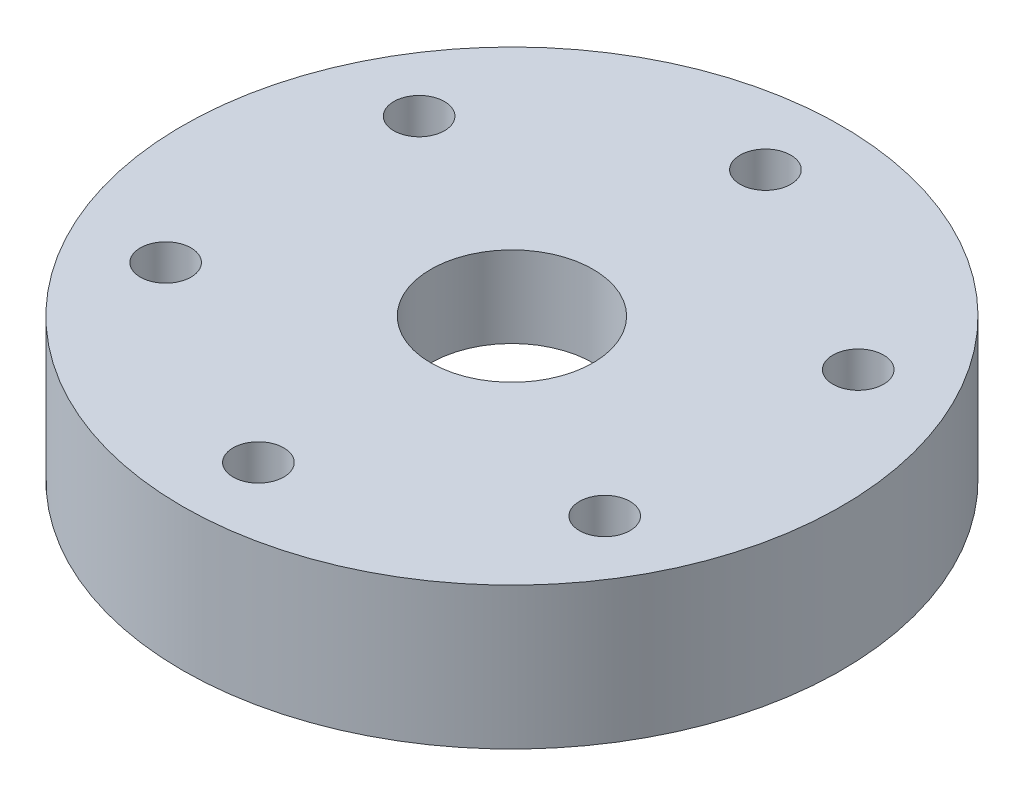
ISO-10303-21;
HEADER;
FILE_DESCRIPTION(('STEP AP214'),'2;1');
FILE_NAME('part.step','',(''),(''),'','','');
FILE_SCHEMA(('AUTOMOTIVE_DESIGN { 1 0 10303 214 1 1 1 1 }'));
ENDSEC;
DATA;
#1=APPLICATION_CONTEXT('core data for automotive mechanical design processes');
#2=APPLICATION_PROTOCOL_DEFINITION('international standard','automotive_design',2000,#1);
#3=PRODUCT_CONTEXT('',#1,'mechanical');
#4=PRODUCT('Part','Part','',(#3));
#5=PRODUCT_RELATED_PRODUCT_CATEGORY('part','',(#4));
#6=PRODUCT_DEFINITION_FORMATION('','',#4);
#7=PRODUCT_DEFINITION_CONTEXT('part definition',#1,'design');
#8=PRODUCT_DEFINITION('design','',#6,#7);
#9=PRODUCT_DEFINITION_SHAPE('','',#8);
#10=(LENGTH_UNIT() NAMED_UNIT(*) SI_UNIT(.MILLI.,.METRE.));
#11=(NAMED_UNIT(*) PLANE_ANGLE_UNIT() SI_UNIT($,.RADIAN.));
#12=(NAMED_UNIT(*) SI_UNIT($,.STERADIAN.) SOLID_ANGLE_UNIT());
#13=UNCERTAINTY_MEASURE_WITH_UNIT(LENGTH_MEASURE(1.E-05),#10,'distance_accuracy_value','');
#14=(GEOMETRIC_REPRESENTATION_CONTEXT(3) GLOBAL_UNCERTAINTY_ASSIGNED_CONTEXT((#13)) GLOBAL_UNIT_ASSIGNED_CONTEXT((#10,
#11,#12)) REPRESENTATION_CONTEXT('',''));
#15=CARTESIAN_POINT('',(0.,0.,0.));
#16=DIRECTION('',(0.,0.,1.));
#17=DIRECTION('',(1.,0.,0.));
#18=AXIS2_PLACEMENT_3D('',#15,#16,#17);
#19=CARTESIAN_POINT('',(0.,16.7085798816568,0.));
#20=DIRECTION('',(0.,1.,0.));
#21=DIRECTION('',(0.,0.,1.));
#22=AXIS2_PLACEMENT_3D('',#19,#20,#21);
#23=CYLINDRICAL_SURFACE('',#22,32.5);
#24=CARTESIAN_POINT('',(0.,-9.78550295857989,0.));
#25=DIRECTION('',(0.,1.,0.));
#26=DIRECTION('',(0.,0.,1.));
#27=AXIS2_PLACEMENT_3D('',#24,#25,#26);
#28=CIRCLE('',#27,32.5);
#29=CARTESIAN_POINT('',(0.,-9.78550295857989,32.5));
#30=VERTEX_POINT('',#29);
#31=EDGE_CURVE('E10',#30,#30,#28,.T.);
#32=ORIENTED_EDGE('',*,*,#31,.T.);
#33=EDGE_LOOP('',(#32));
#34=FACE_BOUND('',#33,.T.);
#35=CARTESIAN_POINT('',(0.,4.21449704142011,0.));
#36=DIRECTION('',(0.,1.,0.));
#37=DIRECTION('',(0.,0.,1.));
#38=AXIS2_PLACEMENT_3D('',#35,#36,#37);
#39=CIRCLE('',#38,32.5);
#40=CARTESIAN_POINT('',(0.,4.21449704142011,32.5));
#41=VERTEX_POINT('',#40);
#42=EDGE_CURVE('E64',#41,#41,#39,.T.);
#43=ORIENTED_EDGE('',*,*,#42,.F.);
#44=EDGE_LOOP('',(#43));
#45=FACE_BOUND('',#44,.T.);
#46=ADVANCED_FACE('F31',(#34,#45),#23,.T.);
#47=CARTESIAN_POINT('',(-32.5,-9.78550295857989,0.));
#48=DIRECTION('',(0.,-1.,0.));
#49=DIRECTION('',(0.,0.,-1.));
#50=AXIS2_PLACEMENT_3D('',#47,#48,#49);
#51=PLANE('',#50);
#52=CARTESIAN_POINT('',(0.,-9.78550295857989,25.));
#53=DIRECTION('',(0.,-1.,0.));
#54=DIRECTION('',(0.,0.,-1.));
#55=AXIS2_PLACEMENT_3D('',#52,#53,#54);
#56=CIRCLE('',#55,2.5);
#57=CARTESIAN_POINT('',(0.,-9.78550295857989,22.5));
#58=VERTEX_POINT('',#57);
#59=EDGE_CURVE('E51',#58,#58,#56,.T.);
#60=ORIENTED_EDGE('',*,*,#59,.F.);
#61=EDGE_LOOP('',(#60));
#62=FACE_BOUND('',#61,.T.);
#63=CARTESIAN_POINT('',(-21.6506350946104,-9.78550295857989,12.4999999999991));
#64=DIRECTION('',(0.,-1.,0.));
#65=DIRECTION('',(0.,0.,-1.));
#66=AXIS2_PLACEMENT_3D('',#63,#64,#65);
#67=CIRCLE('',#66,2.50000000000107);
#68=CARTESIAN_POINT('',(-21.6506350946104,-9.78550295857989,9.99999999999799));
#69=VERTEX_POINT('',#68);
#70=EDGE_CURVE('E114',#69,#69,#67,.T.);
#71=ORIENTED_EDGE('',*,*,#70,.F.);
#72=EDGE_LOOP('',(#71));
#73=FACE_BOUND('',#72,.T.);
#74=CARTESIAN_POINT('',(-21.6506350946094,-9.78550295857989,-12.5000000000009));
#75=DIRECTION('',(0.,-1.,0.));
#76=DIRECTION('',(0.,0.,-1.));
#77=AXIS2_PLACEMENT_3D('',#74,#75,#76);
#78=CIRCLE('',#77,2.50000000000202);
#79=CARTESIAN_POINT('',(-21.6506350946094,-9.78550295857989,-15.000000000003));
#80=VERTEX_POINT('',#79);
#81=EDGE_CURVE('E76',#80,#80,#78,.T.);
#82=ORIENTED_EDGE('',*,*,#81,.F.);
#83=EDGE_LOOP('',(#82));
#84=FACE_BOUND('',#83,.T.);
#85=CARTESIAN_POINT('',(2.1224433562867E-12,-9.78550295857989,-25.));
#86=DIRECTION('',(0.,-1.,0.));
#87=DIRECTION('',(0.,0.,-1.));
#88=AXIS2_PLACEMENT_3D('',#85,#86,#87);
#89=CIRCLE('',#88,2.5000000000022);
#90=CARTESIAN_POINT('',(2.1224433562867E-12,-9.78550295857989,-27.5000000000022));
#91=VERTEX_POINT('',#90);
#92=EDGE_CURVE('E121',#91,#91,#89,.T.);
#93=ORIENTED_EDGE('',*,*,#92,.F.);
#94=EDGE_LOOP('',(#93));
#95=FACE_BOUND('',#94,.T.);
#96=CARTESIAN_POINT('',(21.6506350946126,-9.78550295857989,-12.4999999999991));
#97=DIRECTION('',(0.,-1.,0.));
#98=DIRECTION('',(0.,0.,-1.));
#99=AXIS2_PLACEMENT_3D('',#96,#97,#98);
#100=CIRCLE('',#99,2.50000000000137);
#101=CARTESIAN_POINT('',(21.6506350946126,-9.78550295857989,-15.0000000000004));
#102=VERTEX_POINT('',#101);
#103=EDGE_CURVE('E125',#102,#102,#100,.T.);
#104=ORIENTED_EDGE('',*,*,#103,.F.);
#105=EDGE_LOOP('',(#104));
#106=FACE_BOUND('',#105,.T.);
#107=CARTESIAN_POINT('',(21.6506350946115,-9.78550295857989,12.5000000000009));
#108=DIRECTION('',(0.,-1.,0.));
#109=DIRECTION('',(0.,0.,-1.));
#110=AXIS2_PLACEMENT_3D('',#107,#108,#109);
#111=CIRCLE('',#110,2.5000000000003);
#112=CARTESIAN_POINT('',(21.6506350946115,-9.78550295857989,10.0000000000006));
#113=VERTEX_POINT('',#112);
#114=EDGE_CURVE('E129',#113,#113,#111,.T.);
#115=ORIENTED_EDGE('',*,*,#114,.F.);
#116=EDGE_LOOP('',(#115));
#117=FACE_BOUND('',#116,.T.);
#118=CARTESIAN_POINT('',(0.,-9.78550295857989,0.));
#119=DIRECTION('',(0.,1.,0.));
#120=DIRECTION('',(0.,0.,1.));
#121=AXIS2_PLACEMENT_3D('',#118,#119,#120);
#122=CIRCLE('',#121,17.5);
#123=CARTESIAN_POINT('',(0.,-9.78550295857989,17.5));
#124=VERTEX_POINT('',#123);
#125=EDGE_CURVE('E38',#124,#124,#122,.T.);
#126=ORIENTED_EDGE('',*,*,#125,.T.);
#127=EDGE_LOOP('',(#126));
#128=FACE_BOUND('',#127,.T.);
#129=ORIENTED_EDGE('',*,*,#31,.F.);
#130=EDGE_LOOP('',(#129));
#131=FACE_BOUND('',#130,.T.);
#132=ADVANCED_FACE('F98',(#62,#73,#84,#95,#106,#117,#128,#131),#51,.T.);
#133=CARTESIAN_POINT('',(0.,16.7085798816568,0.));
#134=DIRECTION('',(0.,1.,0.));
#135=DIRECTION('',(0.,0.,1.));
#136=AXIS2_PLACEMENT_3D('',#133,#134,#135);
#137=CYLINDRICAL_SURFACE('',#136,17.5);
#138=CARTESIAN_POINT('',(0.,-3.78550295857989,0.));
#139=DIRECTION('',(0.,1.,0.));
#140=DIRECTION('',(0.,0.,1.));
#141=AXIS2_PLACEMENT_3D('',#138,#139,#140);
#142=CIRCLE('',#141,17.5);
#143=CARTESIAN_POINT('',(0.,-3.78550295857989,17.5));
#144=VERTEX_POINT('',#143);
#145=EDGE_CURVE('E43',#144,#144,#142,.T.);
#146=ORIENTED_EDGE('',*,*,#145,.T.);
#147=EDGE_LOOP('',(#146));
#148=FACE_BOUND('',#147,.T.);
#149=ORIENTED_EDGE('',*,*,#125,.F.);
#150=EDGE_LOOP('',(#149));
#151=FACE_BOUND('',#150,.T.);
#152=ADVANCED_FACE('F83',(#148,#151),#137,.F.);
#153=CARTESIAN_POINT('',(-17.5,-3.78550295857989,0.));
#154=DIRECTION('',(0.,-1.,0.));
#155=DIRECTION('',(0.,0.,-1.));
#156=AXIS2_PLACEMENT_3D('',#153,#154,#155);
#157=PLANE('',#156);
#158=CARTESIAN_POINT('',(0.,-3.78550295857989,0.));
#159=DIRECTION('',(0.,1.,0.));
#160=DIRECTION('',(0.,0.,1.));
#161=AXIS2_PLACEMENT_3D('',#158,#159,#160);
#162=CIRCLE('',#161,8.);
#163=CARTESIAN_POINT('',(0.,-3.78550295857989,8.));
#164=VERTEX_POINT('',#163);
#165=EDGE_CURVE('E73',#164,#164,#162,.T.);
#166=ORIENTED_EDGE('',*,*,#165,.T.);
#167=EDGE_LOOP('',(#166));
#168=FACE_BOUND('',#167,.T.);
#169=ORIENTED_EDGE('',*,*,#145,.F.);
#170=EDGE_LOOP('',(#169));
#171=FACE_BOUND('',#170,.T.);
#172=ADVANCED_FACE('F86',(#168,#171),#157,.T.);
#173=CARTESIAN_POINT('',(0.,16.7085798816568,0.));
#174=DIRECTION('',(0.,1.,0.));
#175=DIRECTION('',(0.,0.,1.));
#176=AXIS2_PLACEMENT_3D('',#173,#174,#175);
#177=CYLINDRICAL_SURFACE('',#176,8.);
#178=CARTESIAN_POINT('',(0.,4.21449704142012,0.));
#179=DIRECTION('',(0.,1.,0.));
#180=DIRECTION('',(0.,0.,1.));
#181=AXIS2_PLACEMENT_3D('',#178,#179,#180);
#182=CIRCLE('',#181,8.);
#183=CARTESIAN_POINT('',(0.,4.21449704142012,8.));
#184=VERTEX_POINT('',#183);
#185=EDGE_CURVE('E68',#184,#184,#182,.T.);
#186=ORIENTED_EDGE('',*,*,#185,.T.);
#187=EDGE_LOOP('',(#186));
#188=FACE_BOUND('',#187,.T.);
#189=ORIENTED_EDGE('',*,*,#165,.F.);
#190=EDGE_LOOP('',(#189));
#191=FACE_BOUND('',#190,.T.);
#192=ADVANCED_FACE('F88',(#188,#191),#177,.F.);
#193=CARTESIAN_POINT('',(-8.,4.21449704142011,0.));
#194=DIRECTION('',(0.,1.,0.));
#195=DIRECTION('',(0.,0.,1.));
#196=AXIS2_PLACEMENT_3D('',#193,#194,#195);
#197=PLANE('',#196);
#198=CARTESIAN_POINT('',(0.,4.21449704142011,25.));
#199=DIRECTION('',(0.,1.,0.));
#200=DIRECTION('',(0.,0.,1.));
#201=AXIS2_PLACEMENT_3D('',#198,#199,#200);
#202=CIRCLE('',#201,2.5);
#203=CARTESIAN_POINT('',(0.,4.21449704142011,27.5));
#204=VERTEX_POINT('',#203);
#205=EDGE_CURVE('E34',#204,#204,#202,.T.);
#206=ORIENTED_EDGE('',*,*,#205,.F.);
#207=EDGE_LOOP('',(#206));
#208=FACE_BOUND('',#207,.T.);
#209=CARTESIAN_POINT('',(-21.6506350946104,4.21449704142011,12.4999999999991));
#210=DIRECTION('',(0.,1.,0.));
#211=DIRECTION('',(0.,0.,1.));
#212=AXIS2_PLACEMENT_3D('',#209,#210,#211);
#213=CIRCLE('',#212,2.50000000000107);
#214=CARTESIAN_POINT('',(-21.6506350946104,4.21449704142011,15.0000000000001));
#215=VERTEX_POINT('',#214);
#216=EDGE_CURVE('E59',#215,#215,#213,.T.);
#217=ORIENTED_EDGE('',*,*,#216,.F.);
#218=EDGE_LOOP('',(#217));
#219=FACE_BOUND('',#218,.T.);
#220=CARTESIAN_POINT('',(-21.6506350946094,4.21449704142011,-12.5000000000009));
#221=DIRECTION('',(0.,1.,0.));
#222=DIRECTION('',(0.,0.,1.));
#223=AXIS2_PLACEMENT_3D('',#220,#221,#222);
#224=CIRCLE('',#223,2.50000000000202);
#225=CARTESIAN_POINT('',(-21.6506350946094,4.21449704142011,-9.9999999999989));
#226=VERTEX_POINT('',#225);
#227=EDGE_CURVE('E57',#226,#226,#224,.T.);
#228=ORIENTED_EDGE('',*,*,#227,.F.);
#229=EDGE_LOOP('',(#228));
#230=FACE_BOUND('',#229,.T.);
#231=CARTESIAN_POINT('',(2.1224433562867E-12,4.21449704142011,-25.));
#232=DIRECTION('',(0.,1.,0.));
#233=DIRECTION('',(0.,0.,1.));
#234=AXIS2_PLACEMENT_3D('',#231,#232,#233);
#235=CIRCLE('',#234,2.5000000000022);
#236=CARTESIAN_POINT('',(2.1224433562867E-12,4.21449704142011,-22.4999999999978));
#237=VERTEX_POINT('',#236);
#238=EDGE_CURVE('E54',#237,#237,#235,.T.);
#239=ORIENTED_EDGE('',*,*,#238,.F.);
#240=EDGE_LOOP('',(#239));
#241=FACE_BOUND('',#240,.T.);
#242=CARTESIAN_POINT('',(21.6506350946126,4.21449704142011,-12.4999999999991));
#243=DIRECTION('',(0.,1.,0.));
#244=DIRECTION('',(0.,0.,1.));
#245=AXIS2_PLACEMENT_3D('',#242,#243,#244);
#246=CIRCLE('',#245,2.50000000000137);
#247=CARTESIAN_POINT('',(21.6506350946126,4.21449704142011,-9.99999999999771));
#248=VERTEX_POINT('',#247);
#249=EDGE_CURVE('E50',#248,#248,#246,.T.);
#250=ORIENTED_EDGE('',*,*,#249,.F.);
#251=EDGE_LOOP('',(#250));
#252=FACE_BOUND('',#251,.T.);
#253=CARTESIAN_POINT('',(21.6506350946115,4.21449704142011,12.5000000000009));
#254=DIRECTION('',(0.,1.,0.));
#255=DIRECTION('',(0.,0.,1.));
#256=AXIS2_PLACEMENT_3D('',#253,#254,#255);
#257=CIRCLE('',#256,2.5000000000003);
#258=CARTESIAN_POINT('',(21.6506350946115,4.21449704142011,15.0000000000012));
#259=VERTEX_POINT('',#258);
#260=EDGE_CURVE('E47',#259,#259,#257,.T.);
#261=ORIENTED_EDGE('',*,*,#260,.F.);
#262=EDGE_LOOP('',(#261));
#263=FACE_BOUND('',#262,.T.);
#264=ORIENTED_EDGE('',*,*,#42,.T.);
#265=EDGE_LOOP('',(#264));
#266=FACE_BOUND('',#265,.T.);
#267=ORIENTED_EDGE('',*,*,#185,.F.);
#268=EDGE_LOOP('',(#267));
#269=FACE_BOUND('',#268,.T.);
#270=ADVANCED_FACE('F95',(#208,#219,#230,#241,#252,#263,#266,#269),#197,.T.);
#271=CARTESIAN_POINT('',(21.6506350946115,13.2144970414201,12.5000000000009));
#272=DIRECTION('',(0.,-1.,0.));
#273=DIRECTION('',(0.,0.,-1.));
#274=AXIS2_PLACEMENT_3D('',#271,#272,#273);
#275=CYLINDRICAL_SURFACE('',#274,2.5000000000003);
#276=ORIENTED_EDGE('',*,*,#260,.T.);
#277=EDGE_LOOP('',(#276));
#278=FACE_BOUND('',#277,.T.);
#279=ORIENTED_EDGE('',*,*,#114,.T.);
#280=EDGE_LOOP('',(#279));
#281=FACE_BOUND('',#280,.T.);
#282=ADVANCED_FACE('F154',(#278,#281),#275,.F.);
#283=CARTESIAN_POINT('',(21.6506350946126,13.2144970414201,-12.4999999999991));
#284=DIRECTION('',(0.,-1.,0.));
#285=DIRECTION('',(0.,0.,-1.));
#286=AXIS2_PLACEMENT_3D('',#283,#284,#285);
#287=CYLINDRICAL_SURFACE('',#286,2.50000000000137);
#288=ORIENTED_EDGE('',*,*,#249,.T.);
#289=EDGE_LOOP('',(#288));
#290=FACE_BOUND('',#289,.T.);
#291=ORIENTED_EDGE('',*,*,#103,.T.);
#292=EDGE_LOOP('',(#291));
#293=FACE_BOUND('',#292,.T.);
#294=ADVANCED_FACE('F157',(#290,#293),#287,.F.);
#295=CARTESIAN_POINT('',(2.1224433562867E-12,13.2144970414201,-25.));
#296=DIRECTION('',(0.,-1.,0.));
#297=DIRECTION('',(0.,0.,-1.));
#298=AXIS2_PLACEMENT_3D('',#295,#296,#297);
#299=CYLINDRICAL_SURFACE('',#298,2.5000000000022);
#300=ORIENTED_EDGE('',*,*,#238,.T.);
#301=EDGE_LOOP('',(#300));
#302=FACE_BOUND('',#301,.T.);
#303=ORIENTED_EDGE('',*,*,#92,.T.);
#304=EDGE_LOOP('',(#303));
#305=FACE_BOUND('',#304,.T.);
#306=ADVANCED_FACE('F150',(#302,#305),#299,.F.);
#307=CARTESIAN_POINT('',(-21.6506350946094,13.2144970414201,-12.5000000000009));
#308=DIRECTION('',(0.,-1.,0.));
#309=DIRECTION('',(0.,0.,-1.));
#310=AXIS2_PLACEMENT_3D('',#307,#308,#309);
#311=CYLINDRICAL_SURFACE('',#310,2.50000000000202);
#312=ORIENTED_EDGE('',*,*,#227,.T.);
#313=EDGE_LOOP('',(#312));
#314=FACE_BOUND('',#313,.T.);
#315=ORIENTED_EDGE('',*,*,#81,.T.);
#316=EDGE_LOOP('',(#315));
#317=FACE_BOUND('',#316,.T.);
#318=ADVANCED_FACE('F143',(#314,#317),#311,.F.);
#319=CARTESIAN_POINT('',(-21.6506350946104,13.2144970414201,12.4999999999991));
#320=DIRECTION('',(0.,-1.,0.));
#321=DIRECTION('',(0.,0.,-1.));
#322=AXIS2_PLACEMENT_3D('',#319,#320,#321);
#323=CYLINDRICAL_SURFACE('',#322,2.50000000000107);
#324=ORIENTED_EDGE('',*,*,#216,.T.);
#325=EDGE_LOOP('',(#324));
#326=FACE_BOUND('',#325,.T.);
#327=ORIENTED_EDGE('',*,*,#70,.T.);
#328=EDGE_LOOP('',(#327));
#329=FACE_BOUND('',#328,.T.);
#330=ADVANCED_FACE('F140',(#326,#329),#323,.F.);
#331=CARTESIAN_POINT('',(0.,13.2144970414201,25.));
#332=DIRECTION('',(0.,-1.,0.));
#333=DIRECTION('',(0.,0.,-1.));
#334=AXIS2_PLACEMENT_3D('',#331,#332,#333);
#335=CYLINDRICAL_SURFACE('',#334,2.5);
#336=ORIENTED_EDGE('',*,*,#205,.T.);
#337=EDGE_LOOP('',(#336));
#338=FACE_BOUND('',#337,.T.);
#339=ORIENTED_EDGE('',*,*,#59,.T.);
#340=EDGE_LOOP('',(#339));
#341=FACE_BOUND('',#340,.T.);
#342=ADVANCED_FACE('F142',(#338,#341),#335,.F.);
#343=CLOSED_SHELL('',(#46,#132,#152,#172,#192,#270,#282,#294,#306,#318,#330,#342));
#344=MANIFOLD_SOLID_BREP('B2',#343);
#345=ADVANCED_BREP_SHAPE_REPRESENTATION('',(#18,#344),#14);
#346=SHAPE_DEFINITION_REPRESENTATION(#9,#345);
ENDSEC;
END-ISO-10303-21;
